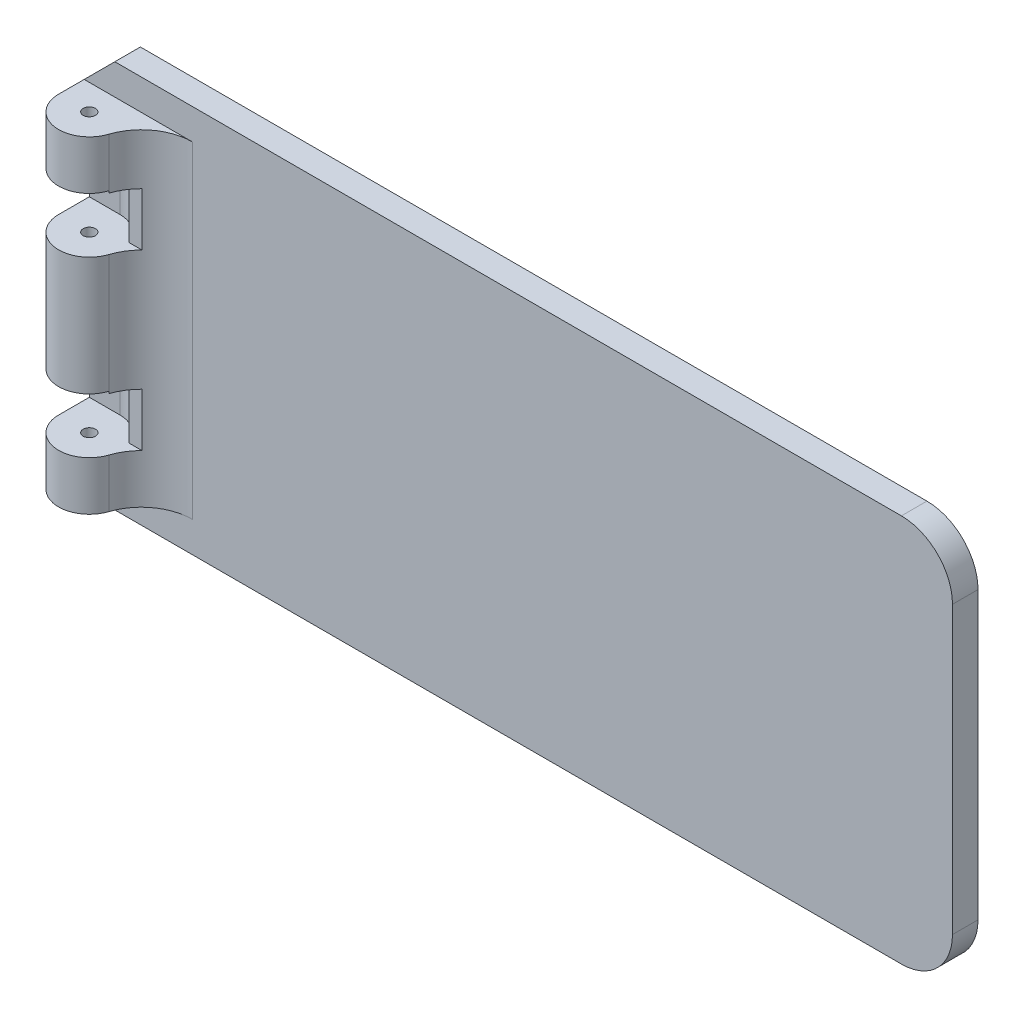
ISO-10303-21;
HEADER;
FILE_DESCRIPTION(('STEP AP214'),'2;1');
FILE_NAME('part.step','',(''),(''),'','','');
FILE_SCHEMA(('AUTOMOTIVE_DESIGN { 1 0 10303 214 1 1 1 1 }'));
ENDSEC;
DATA;
#1=APPLICATION_CONTEXT('core data for automotive mechanical design processes');
#2=APPLICATION_PROTOCOL_DEFINITION('international standard','automotive_design',2000,#1);
#3=PRODUCT_CONTEXT('',#1,'mechanical');
#4=PRODUCT('Part','Part','',(#3));
#5=PRODUCT_RELATED_PRODUCT_CATEGORY('part','',(#4));
#6=PRODUCT_DEFINITION_FORMATION('','',#4);
#7=PRODUCT_DEFINITION_CONTEXT('part definition',#1,'design');
#8=PRODUCT_DEFINITION('design','',#6,#7);
#9=PRODUCT_DEFINITION_SHAPE('','',#8);
#10=(LENGTH_UNIT() NAMED_UNIT(*) SI_UNIT(.MILLI.,.METRE.));
#11=(NAMED_UNIT(*) PLANE_ANGLE_UNIT() SI_UNIT($,.RADIAN.));
#12=(NAMED_UNIT(*) SI_UNIT($,.STERADIAN.) SOLID_ANGLE_UNIT());
#13=UNCERTAINTY_MEASURE_WITH_UNIT(LENGTH_MEASURE(1.E-05),#10,'distance_accuracy_value','');
#14=(GEOMETRIC_REPRESENTATION_CONTEXT(3) GLOBAL_UNCERTAINTY_ASSIGNED_CONTEXT((#13)) GLOBAL_UNIT_ASSIGNED_CONTEXT((#10,
#11,#12)) REPRESENTATION_CONTEXT('',''));
#15=CARTESIAN_POINT('',(0.,0.,0.));
#16=DIRECTION('',(0.,0.,1.));
#17=DIRECTION('',(1.,0.,0.));
#18=AXIS2_PLACEMENT_3D('',#15,#16,#17);
#19=CARTESIAN_POINT('',(3.,38.,5.));
#20=DIRECTION('',(0.,-1.,0.));
#21=DIRECTION('',(0.,0.,-1.));
#22=AXIS2_PLACEMENT_3D('',#19,#20,#21);
#23=CYLINDRICAL_SURFACE('',#22,3.);
#24=CARTESIAN_POINT('',(3.,3.,5.));
#25=DIRECTION('',(0.,-1.,0.));
#26=DIRECTION('',(0.,0.,-1.));
#27=AXIS2_PLACEMENT_3D('',#24,#25,#26);
#28=CIRCLE('',#27,3.);
#29=CARTESIAN_POINT('',(5.8497532787945,3.,5.9375));
#30=VERTEX_POINT('',#29);
#31=CARTESIAN_POINT('',(0.,3.,5.));
#32=VERTEX_POINT('',#31);
#33=EDGE_CURVE('E351',#30,#32,#28,.T.);
#34=ORIENTED_EDGE('',*,*,#33,.F.);
#35=DIRECTION('',(0.,-1.,0.));
#36=VECTOR('',#35,1.);
#37=CARTESIAN_POINT('',(5.8497532787945,38.,5.9375));
#38=LINE('',#37,#36);
#39=CARTESIAN_POINT('',(5.8497532787945,7.80000000000001,5.93750000000001));
#40=VERTEX_POINT('',#39);
#41=EDGE_CURVE('E281',#30,#40,#38,.F.);
#42=ORIENTED_EDGE('',*,*,#41,.T.);
#43=CARTESIAN_POINT('',(3.,7.80000000000001,5.));
#44=DIRECTION('',(0.,1.,0.));
#45=DIRECTION('',(-1.,0.,0.));
#46=AXIS2_PLACEMENT_3D('',#43,#44,#45);
#47=CIRCLE('',#46,3.);
#48=CARTESIAN_POINT('',(0.,7.80000000000001,5.));
#49=VERTEX_POINT('',#48);
#50=EDGE_CURVE('E371',#49,#40,#47,.T.);
#51=ORIENTED_EDGE('',*,*,#50,.F.);
#52=DIRECTION('',(0.,-1.,0.));
#53=VECTOR('',#52,1.);
#54=CARTESIAN_POINT('',(0.,38.,5.));
#55=LINE('',#54,#53);
#56=EDGE_CURVE('E275',#49,#32,#55,.T.);
#57=ORIENTED_EDGE('',*,*,#56,.T.);
#58=EDGE_LOOP('',(#34,#42,#51,#57));
#59=FACE_BOUND('',#58,.T.);
#60=ADVANCED_FACE('F35',(#59),#23,.T.);
#61=CARTESIAN_POINT('',(3.,38.,5.));
#62=DIRECTION('',(0.,-1.,0.));
#63=DIRECTION('',(0.,0.,-1.));
#64=AXIS2_PLACEMENT_3D('',#61,#62,#63);
#65=CYLINDRICAL_SURFACE('',#64,0.6);
#66=CARTESIAN_POINT('',(3.,7.80000000000001,5.));
#67=DIRECTION('',(0.,1.,0.));
#68=DIRECTION('',(-1.,0.,0.));
#69=AXIS2_PLACEMENT_3D('',#66,#67,#68);
#70=CIRCLE('',#69,0.6);
#71=CARTESIAN_POINT('',(2.4,7.80000000000001,5.));
#72=VERTEX_POINT('',#71);
#73=EDGE_CURVE('E389',#72,#72,#70,.T.);
#74=ORIENTED_EDGE('',*,*,#73,.T.);
#75=EDGE_LOOP('',(#74));
#76=FACE_BOUND('',#75,.T.);
#77=CARTESIAN_POINT('',(3.,3.,5.));
#78=DIRECTION('',(0.,-1.,0.));
#79=DIRECTION('',(0.,0.,-1.));
#80=AXIS2_PLACEMENT_3D('',#77,#78,#79);
#81=CIRCLE('',#80,0.6);
#82=CARTESIAN_POINT('',(3.,3.,4.4));
#83=VERTEX_POINT('',#82);
#84=EDGE_CURVE('E356',#83,#83,#81,.T.);
#85=ORIENTED_EDGE('',*,*,#84,.T.);
#86=EDGE_LOOP('',(#85));
#87=FACE_BOUND('',#86,.T.);
#88=ADVANCED_FACE('F405',(#76,#87),#65,.F.);
#89=CARTESIAN_POINT('',(10.5993420767853,38.,7.5));
#90=DIRECTION('',(0.,-1.,0.));
#91=DIRECTION('',(0.,0.,-1.));
#92=AXIS2_PLACEMENT_3D('',#89,#90,#91);
#93=CYLINDRICAL_SURFACE('',#92,5.);
#94=CARTESIAN_POINT('',(5.8497532787945,30.,5.93750000000001));
#95=VERTEX_POINT('',#94);
#96=CARTESIAN_POINT('',(5.8497532787945,30.2,5.9375));
#97=VERTEX_POINT('',#96);
#98=EDGE_CURVE('E218',#95,#97,#38,.F.);
#99=ORIENTED_EDGE('',*,*,#98,.F.);
#100=CARTESIAN_POINT('',(10.5993420767853,30.,7.5));
#101=DIRECTION('',(0.,1.,0.));
#102=DIRECTION('',(0.,0.,1.));
#103=AXIS2_PLACEMENT_3D('',#100,#101,#102);
#104=CIRCLE('',#103,5.);
#105=CARTESIAN_POINT('',(7.09098152661378,30.,3.93750000000001));
#106=VERTEX_POINT('',#105);
#107=EDGE_CURVE('E207',#95,#106,#104,.F.);
#108=ORIENTED_EDGE('',*,*,#107,.T.);
#109=DIRECTION('',(0.,-1.,0.));
#110=VECTOR('',#109,1.);
#111=CARTESIAN_POINT('',(7.09098152661378,38.,3.93750000000001));
#112=LINE('',#111,#110);
#113=CARTESIAN_POINT('',(7.09098152661378,24.8,3.93750000000001));
#114=VERTEX_POINT('',#113);
#115=EDGE_CURVE('E202',#106,#114,#112,.T.);
#116=ORIENTED_EDGE('',*,*,#115,.T.);
#117=CARTESIAN_POINT('',(10.5993420767853,24.8,7.5));
#118=DIRECTION('',(0.,-1.,0.));
#119=DIRECTION('',(0.,0.,-1.));
#120=AXIS2_PLACEMENT_3D('',#117,#118,#119);
#121=CIRCLE('',#120,5.);
#122=CARTESIAN_POINT('',(5.8497532787945,24.8,5.93750000000001));
#123=VERTEX_POINT('',#122);
#124=EDGE_CURVE('E195',#114,#123,#121,.F.);
#125=ORIENTED_EDGE('',*,*,#124,.T.);
#126=CARTESIAN_POINT('',(5.84975327879451,13.2,5.9375));
#127=VERTEX_POINT('',#126);
#128=EDGE_CURVE('E200',#127,#123,#38,.F.);
#129=ORIENTED_EDGE('',*,*,#128,.F.);
#130=CARTESIAN_POINT('',(5.8497532787945,13.,5.93750000000001));
#131=VERTEX_POINT('',#130);
#132=EDGE_CURVE('E217',#131,#127,#38,.F.);
#133=ORIENTED_EDGE('',*,*,#132,.F.);
#134=CARTESIAN_POINT('',(10.5993420767853,13.,7.5));
#135=DIRECTION('',(0.,1.,0.));
#136=DIRECTION('',(0.,0.,1.));
#137=AXIS2_PLACEMENT_3D('',#134,#135,#136);
#138=CIRCLE('',#137,5.);
#139=CARTESIAN_POINT('',(7.09098152661378,13.,3.93750000000001));
#140=VERTEX_POINT('',#139);
#141=EDGE_CURVE('E329',#131,#140,#138,.F.);
#142=ORIENTED_EDGE('',*,*,#141,.T.);
#143=DIRECTION('',(0.,-1.,0.));
#144=VECTOR('',#143,1.);
#145=CARTESIAN_POINT('',(7.09098152661378,38.,3.93750000000001));
#146=LINE('',#145,#144);
#147=CARTESIAN_POINT('',(7.09098152661378,7.80000000000001,3.93750000000001));
#148=VERTEX_POINT('',#147);
#149=EDGE_CURVE('E338',#140,#148,#146,.T.);
#150=ORIENTED_EDGE('',*,*,#149,.T.);
#151=CARTESIAN_POINT('',(10.5993420767853,7.80000000000001,7.5));
#152=DIRECTION('',(0.,-1.,0.));
#153=DIRECTION('',(0.,0.,-1.));
#154=AXIS2_PLACEMENT_3D('',#151,#152,#153);
#155=CIRCLE('',#154,5.);
#156=EDGE_CURVE('E341',#148,#40,#155,.F.);
#157=ORIENTED_EDGE('',*,*,#156,.T.);
#158=ORIENTED_EDGE('',*,*,#41,.F.);
#159=CARTESIAN_POINT('',(10.5993420767853,3.,7.5));
#160=DIRECTION('',(0.,-1.,0.));
#161=DIRECTION('',(0.,0.,-1.));
#162=AXIS2_PLACEMENT_3D('',#159,#160,#161);
#163=CIRCLE('',#162,5.);
#164=CARTESIAN_POINT('',(10.5993420767853,3.,2.5));
#165=VERTEX_POINT('',#164);
#166=EDGE_CURVE('E287',#165,#30,#163,.F.);
#167=ORIENTED_EDGE('',*,*,#166,.F.);
#168=DIRECTION('',(0.,1.,0.));
#169=VECTOR('',#168,1.);
#170=CARTESIAN_POINT('',(10.5993420767853,0.,2.5));
#171=LINE('',#170,#169);
#172=CARTESIAN_POINT('',(10.5993420767853,35.,2.5));
#173=VERTEX_POINT('',#172);
#174=EDGE_CURVE('E278',#173,#165,#171,.F.);
#175=ORIENTED_EDGE('',*,*,#174,.F.);
#176=CARTESIAN_POINT('',(10.5993420767853,35.,7.5));
#177=DIRECTION('',(0.,-1.,0.));
#178=DIRECTION('',(0.,0.,-1.));
#179=AXIS2_PLACEMENT_3D('',#176,#177,#178);
#180=CIRCLE('',#179,5.);
#181=CARTESIAN_POINT('',(5.8497532787945,35.,5.9375));
#182=VERTEX_POINT('',#181);
#183=EDGE_CURVE('E284',#173,#182,#180,.F.);
#184=ORIENTED_EDGE('',*,*,#183,.T.);
#185=EDGE_CURVE('E220',#97,#182,#38,.F.);
#186=ORIENTED_EDGE('',*,*,#185,.F.);
#187=EDGE_LOOP('',(#99,#108,#116,#125,#129,#133,#142,#150,#157,#158,#167,#175,#184,#186));
#188=FACE_BOUND('',#187,.T.);
#189=ADVANCED_FACE('F198',(#188),#93,.F.);
#190=CARTESIAN_POINT('',(0.,24.8,5.));
#191=VERTEX_POINT('',#190);
#192=CARTESIAN_POINT('',(0.,13.2,5.));
#193=VERTEX_POINT('',#192);
#194=EDGE_CURVE('E279',#191,#193,#55,.T.);
#195=ORIENTED_EDGE('',*,*,#194,.T.);
#196=CARTESIAN_POINT('',(3.,13.2,5.));
#197=DIRECTION('',(0.,1.,0.));
#198=DIRECTION('',(-1.,0.,0.));
#199=AXIS2_PLACEMENT_3D('',#196,#197,#198);
#200=CIRCLE('',#199,3.);
#201=EDGE_CURVE('E216',#193,#127,#200,.T.);
#202=ORIENTED_EDGE('',*,*,#201,.T.);
#203=ORIENTED_EDGE('',*,*,#128,.T.);
#204=CARTESIAN_POINT('',(3.,24.8,5.));
#205=DIRECTION('',(0.,1.,0.));
#206=DIRECTION('',(0.,0.,1.));
#207=AXIS2_PLACEMENT_3D('',#204,#205,#206);
#208=CIRCLE('',#207,3.);
#209=EDGE_CURVE('E214',#191,#123,#208,.T.);
#210=ORIENTED_EDGE('',*,*,#209,.F.);
#211=EDGE_LOOP('',(#195,#202,#203,#210));
#212=FACE_BOUND('',#211,.T.);
#213=ADVANCED_FACE('F213',(#212),#23,.T.);
#214=CARTESIAN_POINT('',(3.,13.2,5.));
#215=DIRECTION('',(0.,1.,0.));
#216=DIRECTION('',(-1.,0.,0.));
#217=AXIS2_PLACEMENT_3D('',#214,#215,#216);
#218=CIRCLE('',#217,0.6);
#219=CARTESIAN_POINT('',(2.4,13.2,5.));
#220=VERTEX_POINT('',#219);
#221=EDGE_CURVE('E229',#220,#220,#218,.T.);
#222=ORIENTED_EDGE('',*,*,#221,.F.);
#223=EDGE_LOOP('',(#222));
#224=FACE_BOUND('',#223,.T.);
#225=CARTESIAN_POINT('',(3.,24.8,5.));
#226=DIRECTION('',(0.,1.,0.));
#227=DIRECTION('',(0.,0.,1.));
#228=AXIS2_PLACEMENT_3D('',#225,#226,#227);
#229=CIRCLE('',#228,0.6);
#230=CARTESIAN_POINT('',(3.,24.8,5.6));
#231=VERTEX_POINT('',#230);
#232=EDGE_CURVE('E248',#231,#231,#229,.T.);
#233=ORIENTED_EDGE('',*,*,#232,.T.);
#234=EDGE_LOOP('',(#233));
#235=FACE_BOUND('',#234,.T.);
#236=ADVANCED_FACE('F399',(#224,#235),#65,.F.);
#237=CARTESIAN_POINT('',(0.,38.,0.));
#238=DIRECTION('',(1.,0.,0.));
#239=DIRECTION('',(0.,0.,-1.));
#240=AXIS2_PLACEMENT_3D('',#237,#238,#239);
#241=PLANE('',#240);
#242=DIRECTION('',(0.,0.,-1.));
#243=VECTOR('',#242,1.);
#244=CARTESIAN_POINT('',(0.,35.,0.));
#245=LINE('',#244,#243);
#246=CARTESIAN_POINT('',(0.,35.,5.));
#247=VERTEX_POINT('',#246);
#248=CARTESIAN_POINT('',(0.,35.,2.5));
#249=VERTEX_POINT('',#248);
#250=EDGE_CURVE('E365',#247,#249,#245,.T.);
#251=ORIENTED_EDGE('',*,*,#250,.T.);
#252=DIRECTION('',(0.,0.,-1.));
#253=VECTOR('',#252,1.);
#254=CARTESIAN_POINT('',(0.,35.,0.));
#255=LINE('',#254,#253);
#256=CARTESIAN_POINT('',(0.,35.,0.));
#257=VERTEX_POINT('',#256);
#258=EDGE_CURVE('E299',#249,#257,#255,.T.);
#259=ORIENTED_EDGE('',*,*,#258,.T.);
#260=DIRECTION('',(0.,-1.,0.));
#261=VECTOR('',#260,1.);
#262=CARTESIAN_POINT('',(0.,38.,0.));
#263=LINE('',#262,#261);
#264=CARTESIAN_POINT('',(0.,3.,0.));
#265=VERTEX_POINT('',#264);
#266=EDGE_CURVE('E262',#257,#265,#263,.T.);
#267=ORIENTED_EDGE('',*,*,#266,.T.);
#268=DIRECTION('',(0.,0.,1.));
#269=VECTOR('',#268,1.);
#270=CARTESIAN_POINT('',(0.,3.,0.));
#271=LINE('',#270,#269);
#272=CARTESIAN_POINT('',(0.,3.,2.5));
#273=VERTEX_POINT('',#272);
#274=EDGE_CURVE('E296',#265,#273,#271,.T.);
#275=ORIENTED_EDGE('',*,*,#274,.T.);
#276=DIRECTION('',(0.,0.,-1.));
#277=VECTOR('',#276,1.);
#278=CARTESIAN_POINT('',(0.,3.,0.));
#279=LINE('',#278,#277);
#280=EDGE_CURVE('E353',#32,#273,#279,.T.);
#281=ORIENTED_EDGE('',*,*,#280,.F.);
#282=ORIENTED_EDGE('',*,*,#56,.F.);
#283=DIRECTION('',(0.,0.,1.));
#284=VECTOR('',#283,1.);
#285=CARTESIAN_POINT('',(0.,7.80000000000001,0.));
#286=LINE('',#285,#284);
#287=CARTESIAN_POINT('',(0.,7.80000000000001,2.));
#288=VERTEX_POINT('',#287);
#289=EDGE_CURVE('E377',#288,#49,#286,.T.);
#290=ORIENTED_EDGE('',*,*,#289,.F.);
#291=DIRECTION('',(0.,-1.,0.));
#292=VECTOR('',#291,1.);
#293=CARTESIAN_POINT('',(0.,13.2,2.));
#294=LINE('',#293,#292);
#295=CARTESIAN_POINT('',(0.,13.2,2.));
#296=VERTEX_POINT('',#295);
#297=EDGE_CURVE('E386',#296,#288,#294,.T.);
#298=ORIENTED_EDGE('',*,*,#297,.F.);
#299=DIRECTION('',(0.,0.,1.));
#300=VECTOR('',#299,1.);
#301=CARTESIAN_POINT('',(0.,13.2,0.));
#302=LINE('',#301,#300);
#303=EDGE_CURVE('E383',#296,#193,#302,.T.);
#304=ORIENTED_EDGE('',*,*,#303,.T.);
#305=ORIENTED_EDGE('',*,*,#194,.F.);
#306=DIRECTION('',(0.,0.,1.));
#307=VECTOR('',#306,1.);
#308=CARTESIAN_POINT('',(0.,24.8,0.));
#309=LINE('',#308,#307);
#310=CARTESIAN_POINT('',(0.,24.8,2.));
#311=VERTEX_POINT('',#310);
#312=EDGE_CURVE('E224',#311,#191,#309,.T.);
#313=ORIENTED_EDGE('',*,*,#312,.F.);
#314=DIRECTION('',(0.,-1.,0.));
#315=VECTOR('',#314,1.);
#316=CARTESIAN_POINT('',(0.,30.2,2.));
#317=LINE('',#316,#315);
#318=CARTESIAN_POINT('',(0.,30.2,2.));
#319=VERTEX_POINT('',#318);
#320=EDGE_CURVE('E243',#319,#311,#317,.T.);
#321=ORIENTED_EDGE('',*,*,#320,.F.);
#322=DIRECTION('',(0.,0.,1.));
#323=VECTOR('',#322,1.);
#324=CARTESIAN_POINT('',(0.,30.2,0.));
#325=LINE('',#324,#323);
#326=CARTESIAN_POINT('',(0.,30.2,5.));
#327=VERTEX_POINT('',#326);
#328=EDGE_CURVE('E240',#319,#327,#325,.T.);
#329=ORIENTED_EDGE('',*,*,#328,.T.);
#330=EDGE_CURVE('E276',#247,#327,#55,.T.);
#331=ORIENTED_EDGE('',*,*,#330,.F.);
#332=EDGE_LOOP('',(#251,#259,#267,#275,#281,#282,#290,#298,#304,#305,#313,#321,#329,#331));
#333=FACE_BOUND('',#332,.T.);
#334=ADVANCED_FACE('F402',(#333),#241,.F.);
#335=ORIENTED_EDGE('',*,*,#185,.T.);
#336=CARTESIAN_POINT('',(3.,35.,5.));
#337=DIRECTION('',(0.,-1.,0.));
#338=DIRECTION('',(0.,0.,-1.));
#339=AXIS2_PLACEMENT_3D('',#336,#337,#338);
#340=CIRCLE('',#339,3.);
#341=EDGE_CURVE('E362',#182,#247,#340,.T.);
#342=ORIENTED_EDGE('',*,*,#341,.T.);
#343=ORIENTED_EDGE('',*,*,#330,.T.);
#344=CARTESIAN_POINT('',(3.,30.2,5.));
#345=DIRECTION('',(0.,1.,0.));
#346=DIRECTION('',(0.,0.,1.));
#347=AXIS2_PLACEMENT_3D('',#344,#345,#346);
#348=CIRCLE('',#347,3.);
#349=EDGE_CURVE('E235',#327,#97,#348,.T.);
#350=ORIENTED_EDGE('',*,*,#349,.T.);
#351=EDGE_LOOP('',(#335,#342,#343,#350));
#352=FACE_BOUND('',#351,.T.);
#353=ADVANCED_FACE('F423',(#352),#23,.T.);
#354=CARTESIAN_POINT('',(0.,38.,2.5));
#355=DIRECTION('',(0.,0.,-1.));
#356=DIRECTION('',(-1.,0.,0.));
#357=AXIS2_PLACEMENT_3D('',#354,#355,#356);
#358=PLANE('',#357);
#359=DIRECTION('',(1.,0.,0.));
#360=VECTOR('',#359,1.);
#361=CARTESIAN_POINT('',(0.,0.,2.5));
#362=LINE('',#361,#360);
#363=CARTESIAN_POINT('',(3.00000000000003,0.,2.5));
#364=VERTEX_POINT('',#363);
#365=CARTESIAN_POINT('',(80.,0.,2.5));
#366=VERTEX_POINT('',#365);
#367=EDGE_CURVE('E254',#364,#366,#362,.T.);
#368=ORIENTED_EDGE('',*,*,#367,.T.);
#369=CARTESIAN_POINT('',(80.,5.,2.5));
#370=DIRECTION('',(0.,0.,-1.));
#371=DIRECTION('',(-1.,0.,0.));
#372=AXIS2_PLACEMENT_3D('',#369,#370,#371);
#373=CIRCLE('',#372,5.);
#374=CARTESIAN_POINT('',(85.,5.,2.5));
#375=VERTEX_POINT('',#374);
#376=EDGE_CURVE('E312',#366,#375,#373,.F.);
#377=ORIENTED_EDGE('',*,*,#376,.T.);
#378=DIRECTION('',(0.,-1.,0.));
#379=VECTOR('',#378,1.);
#380=CARTESIAN_POINT('',(85.,38.,2.5));
#381=LINE('',#380,#379);
#382=CARTESIAN_POINT('',(85.,33.,2.5));
#383=VERTEX_POINT('',#382);
#384=EDGE_CURVE('E272',#383,#375,#381,.T.);
#385=ORIENTED_EDGE('',*,*,#384,.F.);
#386=CARTESIAN_POINT('',(80.,33.,2.5));
#387=DIRECTION('',(0.,0.,-1.));
#388=DIRECTION('',(-1.,0.,0.));
#389=AXIS2_PLACEMENT_3D('',#386,#387,#388);
#390=CIRCLE('',#389,5.);
#391=CARTESIAN_POINT('',(80.,38.,2.5));
#392=VERTEX_POINT('',#391);
#393=EDGE_CURVE('E310',#383,#392,#390,.F.);
#394=ORIENTED_EDGE('',*,*,#393,.T.);
#395=DIRECTION('',(1.,0.,0.));
#396=VECTOR('',#395,1.);
#397=CARTESIAN_POINT('',(0.,38.,2.5));
#398=LINE('',#397,#396);
#399=CARTESIAN_POINT('',(3.,38.,2.5));
#400=VERTEX_POINT('',#399);
#401=EDGE_CURVE('E255',#400,#392,#398,.T.);
#402=ORIENTED_EDGE('',*,*,#401,.F.);
#403=DIRECTION('',(-0.707106781186544,-0.707106781186551,0.));
#404=VECTOR('',#403,1.);
#405=CARTESIAN_POINT('',(3.,38.,2.5));
#406=LINE('',#405,#404);
#407=EDGE_CURVE('E294',#400,#249,#406,.T.);
#408=ORIENTED_EDGE('',*,*,#407,.T.);
#409=DIRECTION('',(-1.,0.,0.));
#410=VECTOR('',#409,1.);
#411=CARTESIAN_POINT('',(13.726266396713,35.,2.5));
#412=LINE('',#411,#410);
#413=EDGE_CURVE('E359',#173,#249,#412,.T.);
#414=ORIENTED_EDGE('',*,*,#413,.F.);
#415=ORIENTED_EDGE('',*,*,#174,.T.);
#416=DIRECTION('',(1.,0.,0.));
#417=VECTOR('',#416,1.);
#418=CARTESIAN_POINT('',(25.4714521459505,3.,2.5));
#419=LINE('',#418,#417);
#420=EDGE_CURVE('E349',#273,#165,#419,.T.);
#421=ORIENTED_EDGE('',*,*,#420,.F.);
#422=DIRECTION('',(-0.707106781186551,0.707106781186544,0.));
#423=VECTOR('',#422,1.);
#424=CARTESIAN_POINT('',(0.,3.,2.5));
#425=LINE('',#424,#423);
#426=EDGE_CURVE('E292',#273,#364,#425,.F.);
#427=ORIENTED_EDGE('',*,*,#426,.T.);
#428=EDGE_LOOP('',(#368,#377,#385,#394,#402,#408,#414,#415,#421,#427));
#429=FACE_BOUND('',#428,.T.);
#430=ADVANCED_FACE('F432',(#429),#358,.F.);
#431=CARTESIAN_POINT('',(85.,38.,0.));
#432=DIRECTION('',(1.,0.,0.));
#433=DIRECTION('',(0.,0.,-1.));
#434=AXIS2_PLACEMENT_3D('',#431,#432,#433);
#435=PLANE('',#434);
#436=ORIENTED_EDGE('',*,*,#384,.T.);
#437=DIRECTION('',(0.,0.,1.));
#438=VECTOR('',#437,1.);
#439=CARTESIAN_POINT('',(85.,5.,0.));
#440=LINE('',#439,#438);
#441=CARTESIAN_POINT('',(85.,5.,0.));
#442=VERTEX_POINT('',#441);
#443=EDGE_CURVE('E317',#375,#442,#440,.F.);
#444=ORIENTED_EDGE('',*,*,#443,.T.);
#445=DIRECTION('',(0.,-1.,0.));
#446=VECTOR('',#445,1.);
#447=CARTESIAN_POINT('',(85.,38.,0.));
#448=LINE('',#447,#446);
#449=CARTESIAN_POINT('',(85.,33.,0.));
#450=VERTEX_POINT('',#449);
#451=EDGE_CURVE('E269',#450,#442,#448,.T.);
#452=ORIENTED_EDGE('',*,*,#451,.F.);
#453=DIRECTION('',(0.,0.,1.));
#454=VECTOR('',#453,1.);
#455=CARTESIAN_POINT('',(85.,33.,0.));
#456=LINE('',#455,#454);
#457=EDGE_CURVE('E314',#450,#383,#456,.T.);
#458=ORIENTED_EDGE('',*,*,#457,.T.);
#459=EDGE_LOOP('',(#436,#444,#452,#458));
#460=FACE_BOUND('',#459,.T.);
#461=ADVANCED_FACE('F438',(#460),#435,.T.);
#462=CARTESIAN_POINT('',(0.,38.,0.));
#463=DIRECTION('',(0.,0.,-1.));
#464=DIRECTION('',(-1.,0.,0.));
#465=AXIS2_PLACEMENT_3D('',#462,#463,#464);
#466=PLANE('',#465);
#467=ORIENTED_EDGE('',*,*,#451,.T.);
#468=CARTESIAN_POINT('',(80.,5.,0.));
#469=DIRECTION('',(0.,0.,-1.));
#470=DIRECTION('',(-1.,0.,0.));
#471=AXIS2_PLACEMENT_3D('',#468,#469,#470);
#472=CIRCLE('',#471,5.);
#473=CARTESIAN_POINT('',(80.,0.,0.));
#474=VERTEX_POINT('',#473);
#475=EDGE_CURVE('E321',#442,#474,#472,.T.);
#476=ORIENTED_EDGE('',*,*,#475,.T.);
#477=DIRECTION('',(1.,0.,0.));
#478=VECTOR('',#477,1.);
#479=CARTESIAN_POINT('',(0.,0.,0.));
#480=LINE('',#479,#478);
#481=CARTESIAN_POINT('',(3.00000000000003,0.,0.));
#482=VERTEX_POINT('',#481);
#483=EDGE_CURVE('E259',#482,#474,#480,.T.);
#484=ORIENTED_EDGE('',*,*,#483,.F.);
#485=DIRECTION('',(0.707106781186551,-0.707106781186544,0.));
#486=VECTOR('',#485,1.);
#487=CARTESIAN_POINT('',(-17.5,20.4999999999998,0.));
#488=LINE('',#487,#486);
#489=EDGE_CURVE('E301',#482,#265,#488,.F.);
#490=ORIENTED_EDGE('',*,*,#489,.T.);
#491=ORIENTED_EDGE('',*,*,#266,.F.);
#492=DIRECTION('',(0.707106781186544,0.707106781186551,0.));
#493=VECTOR('',#492,1.);
#494=CARTESIAN_POINT('',(1.50000000000002,36.5,0.));
#495=LINE('',#494,#493);
#496=CARTESIAN_POINT('',(3.,38.,0.));
#497=VERTEX_POINT('',#496);
#498=EDGE_CURVE('E303',#257,#497,#495,.T.);
#499=ORIENTED_EDGE('',*,*,#498,.T.);
#500=DIRECTION('',(1.,0.,0.));
#501=VECTOR('',#500,1.);
#502=CARTESIAN_POINT('',(0.,38.,0.));
#503=LINE('',#502,#501);
#504=CARTESIAN_POINT('',(80.,38.,0.));
#505=VERTEX_POINT('',#504);
#506=EDGE_CURVE('E258',#497,#505,#503,.T.);
#507=ORIENTED_EDGE('',*,*,#506,.T.);
#508=CARTESIAN_POINT('',(80.,33.,0.));
#509=DIRECTION('',(0.,0.,-1.));
#510=DIRECTION('',(-1.,0.,0.));
#511=AXIS2_PLACEMENT_3D('',#508,#509,#510);
#512=CIRCLE('',#511,5.);
#513=EDGE_CURVE('E319',#505,#450,#512,.T.);
#514=ORIENTED_EDGE('',*,*,#513,.T.);
#515=EDGE_LOOP('',(#467,#476,#484,#490,#491,#499,#507,#514));
#516=FACE_BOUND('',#515,.T.);
#517=ADVANCED_FACE('F489',(#516),#466,.T.);
#518=CARTESIAN_POINT('',(3.,35.,5.));
#519=DIRECTION('',(0.,-1.,0.));
#520=DIRECTION('',(0.,0.,-1.));
#521=AXIS2_PLACEMENT_3D('',#518,#519,#520);
#522=CIRCLE('',#521,0.6);
#523=CARTESIAN_POINT('',(3.,35.,4.4));
#524=VERTEX_POINT('',#523);
#525=EDGE_CURVE('E368',#524,#524,#522,.T.);
#526=ORIENTED_EDGE('',*,*,#525,.F.);
#527=EDGE_LOOP('',(#526));
#528=FACE_BOUND('',#527,.T.);
#529=CARTESIAN_POINT('',(3.,30.2,5.));
#530=DIRECTION('',(0.,1.,0.));
#531=DIRECTION('',(0.,0.,1.));
#532=AXIS2_PLACEMENT_3D('',#529,#530,#531);
#533=CIRCLE('',#532,0.6);
#534=CARTESIAN_POINT('',(3.,30.2,5.6));
#535=VERTEX_POINT('',#534);
#536=EDGE_CURVE('E251',#535,#535,#533,.T.);
#537=ORIENTED_EDGE('',*,*,#536,.F.);
#538=EDGE_LOOP('',(#537));
#539=FACE_BOUND('',#538,.T.);
#540=ADVANCED_FACE('F404',(#528,#539),#65,.F.);
#541=CARTESIAN_POINT('',(0.,38.,0.));
#542=DIRECTION('',(0.,1.,0.));
#543=DIRECTION('',(0.,0.,1.));
#544=AXIS2_PLACEMENT_3D('',#541,#542,#543);
#545=PLANE('',#544);
#546=ORIENTED_EDGE('',*,*,#401,.T.);
#547=DIRECTION('',(0.,0.,1.));
#548=VECTOR('',#547,1.);
#549=CARTESIAN_POINT('',(80.,38.,0.));
#550=LINE('',#549,#548);
#551=EDGE_CURVE('E323',#392,#505,#550,.F.);
#552=ORIENTED_EDGE('',*,*,#551,.T.);
#553=ORIENTED_EDGE('',*,*,#506,.F.);
#554=DIRECTION('',(0.,0.,1.));
#555=VECTOR('',#554,1.);
#556=CARTESIAN_POINT('',(3.,38.,2.5));
#557=LINE('',#556,#555);
#558=EDGE_CURVE('E289',#497,#400,#557,.T.);
#559=ORIENTED_EDGE('',*,*,#558,.T.);
#560=EDGE_LOOP('',(#546,#552,#553,#559));
#561=FACE_BOUND('',#560,.T.);
#562=ADVANCED_FACE('F481',(#561),#545,.T.);
#563=CARTESIAN_POINT('',(0.,0.,0.));
#564=DIRECTION('',(0.,1.,0.));
#565=DIRECTION('',(0.,0.,1.));
#566=AXIS2_PLACEMENT_3D('',#563,#564,#565);
#567=PLANE('',#566);
#568=ORIENTED_EDGE('',*,*,#483,.T.);
#569=DIRECTION('',(0.,0.,1.));
#570=VECTOR('',#569,1.);
#571=CARTESIAN_POINT('',(80.,0.,2.5));
#572=LINE('',#571,#570);
#573=EDGE_CURVE('E307',#474,#366,#572,.T.);
#574=ORIENTED_EDGE('',*,*,#573,.T.);
#575=ORIENTED_EDGE('',*,*,#367,.F.);
#576=DIRECTION('',(0.,0.,-1.));
#577=VECTOR('',#576,1.);
#578=CARTESIAN_POINT('',(3.00000000000003,0.,0.));
#579=LINE('',#578,#577);
#580=EDGE_CURVE('E305',#364,#482,#579,.T.);
#581=ORIENTED_EDGE('',*,*,#580,.T.);
#582=EDGE_LOOP('',(#568,#574,#575,#581));
#583=FACE_BOUND('',#582,.T.);
#584=ADVANCED_FACE('F474',(#583),#567,.F.);
#585=CARTESIAN_POINT('',(3.,30.2,5.));
#586=DIRECTION('',(0.,-1.,0.));
#587=DIRECTION('',(1.,0.,0.));
#588=AXIS2_PLACEMENT_3D('',#585,#586,#587);
#589=CYLINDRICAL_SURFACE('',#588,3.);
#590=CARTESIAN_POINT('',(3.,30.,5.));
#591=DIRECTION('',(0.,1.,0.));
#592=DIRECTION('',(0.,0.,1.));
#593=AXIS2_PLACEMENT_3D('',#590,#591,#592);
#594=CIRCLE('',#593,3.);
#595=CARTESIAN_POINT('',(5.80554696093293,30.,3.93750000000001));
#596=VERTEX_POINT('',#595);
#597=EDGE_CURVE('E11',#95,#596,#594,.T.);
#598=ORIENTED_EDGE('',*,*,#597,.F.);
#599=ORIENTED_EDGE('',*,*,#98,.T.);
#600=CARTESIAN_POINT('',(3.,30.2,2.));
#601=VERTEX_POINT('',#600);
#602=EDGE_CURVE('E234',#97,#601,#348,.T.);
#603=ORIENTED_EDGE('',*,*,#602,.T.);
#604=DIRECTION('',(0.,-1.,0.));
#605=VECTOR('',#604,1.);
#606=CARTESIAN_POINT('',(3.,30.2,2.));
#607=LINE('',#606,#605);
#608=CARTESIAN_POINT('',(3.,24.8,2.));
#609=VERTEX_POINT('',#608);
#610=EDGE_CURVE('E245',#601,#609,#607,.T.);
#611=ORIENTED_EDGE('',*,*,#610,.T.);
#612=CARTESIAN_POINT('',(5.80554696093293,24.8,3.93750000000001));
#613=VERTEX_POINT('',#612);
#614=EDGE_CURVE('E226',#613,#609,#208,.T.);
#615=ORIENTED_EDGE('',*,*,#614,.F.);
#616=DIRECTION('',(0.,-1.,0.));
#617=VECTOR('',#616,1.);
#618=CARTESIAN_POINT('',(5.80554696093293,30.2,3.93750000000001));
#619=LINE('',#618,#617);
#620=EDGE_CURVE('E537',#596,#613,#619,.T.);
#621=ORIENTED_EDGE('',*,*,#620,.F.);
#622=EDGE_LOOP('',(#598,#599,#603,#611,#615,#621));
#623=FACE_BOUND('',#622,.T.);
#624=ADVANCED_FACE('F471',(#623),#589,.F.);
#625=CARTESIAN_POINT('',(0.,30.2,2.));
#626=DIRECTION('',(0.,0.,1.));
#627=DIRECTION('',(1.,0.,0.));
#628=AXIS2_PLACEMENT_3D('',#625,#626,#627);
#629=PLANE('',#628);
#630=ORIENTED_EDGE('',*,*,#610,.F.);
#631=DIRECTION('',(-1.,0.,0.));
#632=VECTOR('',#631,1.);
#633=CARTESIAN_POINT('',(0.,30.2,2.));
#634=LINE('',#633,#632);
#635=EDGE_CURVE('E238',#601,#319,#634,.T.);
#636=ORIENTED_EDGE('',*,*,#635,.T.);
#637=ORIENTED_EDGE('',*,*,#320,.T.);
#638=DIRECTION('',(-1.,0.,0.));
#639=VECTOR('',#638,1.);
#640=CARTESIAN_POINT('',(0.,24.8,2.));
#641=LINE('',#640,#639);
#642=EDGE_CURVE('E225',#609,#311,#641,.T.);
#643=ORIENTED_EDGE('',*,*,#642,.F.);
#644=EDGE_LOOP('',(#630,#636,#637,#643));
#645=FACE_BOUND('',#644,.T.);
#646=ADVANCED_FACE('F417',(#645),#629,.T.);
#647=CARTESIAN_POINT('',(0.,30.2,0.));
#648=DIRECTION('',(0.,1.,0.));
#649=DIRECTION('',(0.,0.,1.));
#650=AXIS2_PLACEMENT_3D('',#647,#648,#649);
#651=PLANE('',#650);
#652=ORIENTED_EDGE('',*,*,#536,.T.);
#653=EDGE_LOOP('',(#652));
#654=FACE_BOUND('',#653,.T.);
#655=ORIENTED_EDGE('',*,*,#349,.F.);
#656=ORIENTED_EDGE('',*,*,#328,.F.);
#657=ORIENTED_EDGE('',*,*,#635,.F.);
#658=ORIENTED_EDGE('',*,*,#602,.F.);
#659=EDGE_LOOP('',(#655,#656,#657,#658));
#660=FACE_BOUND('',#659,.T.);
#661=ADVANCED_FACE('F409',(#654,#660),#651,.F.);
#662=CARTESIAN_POINT('',(0.,24.8,0.));
#663=DIRECTION('',(0.,1.,0.));
#664=DIRECTION('',(0.,0.,1.));
#665=AXIS2_PLACEMENT_3D('',#662,#663,#664);
#666=PLANE('',#665);
#667=ORIENTED_EDGE('',*,*,#232,.F.);
#668=EDGE_LOOP('',(#667));
#669=FACE_BOUND('',#668,.T.);
#670=ORIENTED_EDGE('',*,*,#209,.T.);
#671=ORIENTED_EDGE('',*,*,#124,.F.);
#672=DIRECTION('',(1.,0.,0.));
#673=VECTOR('',#672,1.);
#674=CARTESIAN_POINT('',(3.48326253102262,24.8,3.93750000000001));
#675=LINE('',#674,#673);
#676=EDGE_CURVE('E469',#613,#114,#675,.T.);
#677=ORIENTED_EDGE('',*,*,#676,.F.);
#678=ORIENTED_EDGE('',*,*,#614,.T.);
#679=ORIENTED_EDGE('',*,*,#642,.T.);
#680=ORIENTED_EDGE('',*,*,#312,.T.);
#681=EDGE_LOOP('',(#670,#671,#677,#678,#679,#680));
#682=FACE_BOUND('',#681,.T.);
#683=ADVANCED_FACE('F221',(#669,#682),#666,.T.);
#684=CARTESIAN_POINT('',(3.,13.2,5.));
#685=DIRECTION('',(0.,-1.,0.));
#686=DIRECTION('',(1.,0.,0.));
#687=AXIS2_PLACEMENT_3D('',#684,#685,#686);
#688=CYLINDRICAL_SURFACE('',#687,3.);
#689=CARTESIAN_POINT('',(3.,13.,5.));
#690=DIRECTION('',(0.,1.,0.));
#691=DIRECTION('',(0.,0.,1.));
#692=AXIS2_PLACEMENT_3D('',#689,#690,#691);
#693=CIRCLE('',#692,3.);
#694=CARTESIAN_POINT('',(5.80554696093294,13.,3.93750000000001));
#695=VERTEX_POINT('',#694);
#696=EDGE_CURVE('E43',#131,#695,#693,.T.);
#697=ORIENTED_EDGE('',*,*,#696,.F.);
#698=ORIENTED_EDGE('',*,*,#132,.T.);
#699=CARTESIAN_POINT('',(3.,13.2,2.));
#700=VERTEX_POINT('',#699);
#701=EDGE_CURVE('E379',#127,#700,#200,.T.);
#702=ORIENTED_EDGE('',*,*,#701,.T.);
#703=DIRECTION('',(0.,-1.,0.));
#704=VECTOR('',#703,1.);
#705=CARTESIAN_POINT('',(3.,13.2,2.));
#706=LINE('',#705,#704);
#707=CARTESIAN_POINT('',(3.,7.80000000000001,2.));
#708=VERTEX_POINT('',#707);
#709=EDGE_CURVE('E388',#700,#708,#706,.T.);
#710=ORIENTED_EDGE('',*,*,#709,.T.);
#711=CARTESIAN_POINT('',(5.80554696093294,7.80000000000001,3.93750000000001));
#712=VERTEX_POINT('',#711);
#713=EDGE_CURVE('E335',#712,#708,#47,.T.);
#714=ORIENTED_EDGE('',*,*,#713,.F.);
#715=DIRECTION('',(0.,-1.,0.));
#716=VECTOR('',#715,1.);
#717=CARTESIAN_POINT('',(5.80554696093294,13.2,3.93750000000001));
#718=LINE('',#717,#716);
#719=EDGE_CURVE('E332',#695,#712,#718,.T.);
#720=ORIENTED_EDGE('',*,*,#719,.F.);
#721=EDGE_LOOP('',(#697,#698,#702,#710,#714,#720));
#722=FACE_BOUND('',#721,.T.);
#723=ADVANCED_FACE('F333',(#722),#688,.F.);
#724=CARTESIAN_POINT('',(0.,13.2,2.));
#725=DIRECTION('',(0.,0.,1.));
#726=DIRECTION('',(1.,0.,0.));
#727=AXIS2_PLACEMENT_3D('',#724,#725,#726);
#728=PLANE('',#727);
#729=ORIENTED_EDGE('',*,*,#709,.F.);
#730=DIRECTION('',(-1.,0.,0.));
#731=VECTOR('',#730,1.);
#732=CARTESIAN_POINT('',(0.,13.2,2.));
#733=LINE('',#732,#731);
#734=EDGE_CURVE('E381',#700,#296,#733,.T.);
#735=ORIENTED_EDGE('',*,*,#734,.T.);
#736=ORIENTED_EDGE('',*,*,#297,.T.);
#737=DIRECTION('',(-1.,0.,0.));
#738=VECTOR('',#737,1.);
#739=CARTESIAN_POINT('',(0.,7.80000000000001,2.));
#740=LINE('',#739,#738);
#741=EDGE_CURVE('E374',#708,#288,#740,.T.);
#742=ORIENTED_EDGE('',*,*,#741,.F.);
#743=EDGE_LOOP('',(#729,#735,#736,#742));
#744=FACE_BOUND('',#743,.T.);
#745=ADVANCED_FACE('F415',(#744),#728,.T.);
#746=CARTESIAN_POINT('',(0.,13.2,0.));
#747=DIRECTION('',(0.,1.,0.));
#748=DIRECTION('',(-1.,0.,0.));
#749=AXIS2_PLACEMENT_3D('',#746,#747,#748);
#750=PLANE('',#749);
#751=ORIENTED_EDGE('',*,*,#221,.T.);
#752=EDGE_LOOP('',(#751));
#753=FACE_BOUND('',#752,.T.);
#754=ORIENTED_EDGE('',*,*,#201,.F.);
#755=ORIENTED_EDGE('',*,*,#303,.F.);
#756=ORIENTED_EDGE('',*,*,#734,.F.);
#757=ORIENTED_EDGE('',*,*,#701,.F.);
#758=EDGE_LOOP('',(#754,#755,#756,#757));
#759=FACE_BOUND('',#758,.T.);
#760=ADVANCED_FACE('F396',(#753,#759),#750,.F.);
#761=CARTESIAN_POINT('',(0.,7.80000000000001,0.));
#762=DIRECTION('',(0.,1.,0.));
#763=DIRECTION('',(-1.,0.,0.));
#764=AXIS2_PLACEMENT_3D('',#761,#762,#763);
#765=PLANE('',#764);
#766=ORIENTED_EDGE('',*,*,#73,.F.);
#767=EDGE_LOOP('',(#766));
#768=FACE_BOUND('',#767,.T.);
#769=ORIENTED_EDGE('',*,*,#50,.T.);
#770=ORIENTED_EDGE('',*,*,#156,.F.);
#771=DIRECTION('',(1.,0.,0.));
#772=VECTOR('',#771,1.);
#773=CARTESIAN_POINT('',(3.48326253102262,7.80000000000001,3.93750000000001));
#774=LINE('',#773,#772);
#775=EDGE_CURVE('E343',#712,#148,#774,.T.);
#776=ORIENTED_EDGE('',*,*,#775,.F.);
#777=ORIENTED_EDGE('',*,*,#713,.T.);
#778=ORIENTED_EDGE('',*,*,#741,.T.);
#779=ORIENTED_EDGE('',*,*,#289,.T.);
#780=EDGE_LOOP('',(#769,#770,#776,#777,#778,#779));
#781=FACE_BOUND('',#780,.T.);
#782=ADVANCED_FACE('F457',(#768,#781),#765,.T.);
#783=CARTESIAN_POINT('',(0.,35.,0.));
#784=DIRECTION('',(0.,-1.,0.));
#785=DIRECTION('',(0.,0.,-1.));
#786=AXIS2_PLACEMENT_3D('',#783,#784,#785);
#787=PLANE('',#786);
#788=ORIENTED_EDGE('',*,*,#525,.T.);
#789=EDGE_LOOP('',(#788));
#790=FACE_BOUND('',#789,.T.);
#791=ORIENTED_EDGE('',*,*,#341,.F.);
#792=ORIENTED_EDGE('',*,*,#183,.F.);
#793=ORIENTED_EDGE('',*,*,#413,.T.);
#794=ORIENTED_EDGE('',*,*,#250,.F.);
#795=EDGE_LOOP('',(#791,#792,#793,#794));
#796=FACE_BOUND('',#795,.T.);
#797=ADVANCED_FACE('F527',(#790,#796),#787,.F.);
#798=CARTESIAN_POINT('',(0.,3.,0.));
#799=DIRECTION('',(0.,-1.,0.));
#800=DIRECTION('',(0.,0.,-1.));
#801=AXIS2_PLACEMENT_3D('',#798,#799,#800);
#802=PLANE('',#801);
#803=ORIENTED_EDGE('',*,*,#84,.F.);
#804=EDGE_LOOP('',(#803));
#805=FACE_BOUND('',#804,.T.);
#806=ORIENTED_EDGE('',*,*,#280,.T.);
#807=ORIENTED_EDGE('',*,*,#420,.T.);
#808=ORIENTED_EDGE('',*,*,#166,.T.);
#809=ORIENTED_EDGE('',*,*,#33,.T.);
#810=EDGE_LOOP('',(#806,#807,#808,#809));
#811=FACE_BOUND('',#810,.T.);
#812=ADVANCED_FACE('F532',(#805,#811),#802,.T.);
#813=CARTESIAN_POINT('',(3.,38.,0.));
#814=DIRECTION('',(-0.707106781186551,0.707106781186544,0.));
#815=DIRECTION('',(0.,0.,-1.));
#816=AXIS2_PLACEMENT_3D('',#813,#814,#815);
#817=PLANE('',#816);
#818=ORIENTED_EDGE('',*,*,#498,.F.);
#819=ORIENTED_EDGE('',*,*,#258,.F.);
#820=ORIENTED_EDGE('',*,*,#407,.F.);
#821=ORIENTED_EDGE('',*,*,#558,.F.);
#822=EDGE_LOOP('',(#818,#819,#820,#821));
#823=FACE_BOUND('',#822,.T.);
#824=ADVANCED_FACE('F517',(#823),#817,.T.);
#825=CARTESIAN_POINT('',(0.,3.,0.));
#826=DIRECTION('',(0.707106781186544,0.707106781186551,0.));
#827=DIRECTION('',(0.,0.,1.));
#828=AXIS2_PLACEMENT_3D('',#825,#826,#827);
#829=PLANE('',#828);
#830=ORIENTED_EDGE('',*,*,#489,.F.);
#831=ORIENTED_EDGE('',*,*,#580,.F.);
#832=ORIENTED_EDGE('',*,*,#426,.F.);
#833=ORIENTED_EDGE('',*,*,#274,.F.);
#834=EDGE_LOOP('',(#830,#831,#832,#833));
#835=FACE_BOUND('',#834,.T.);
#836=ADVANCED_FACE('F511',(#835),#829,.F.);
#837=CARTESIAN_POINT('',(80.,5.,0.));
#838=DIRECTION('',(0.,0.,-1.));
#839=DIRECTION('',(-1.,0.,0.));
#840=AXIS2_PLACEMENT_3D('',#837,#838,#839);
#841=CYLINDRICAL_SURFACE('',#840,5.);
#842=ORIENTED_EDGE('',*,*,#475,.F.);
#843=ORIENTED_EDGE('',*,*,#443,.F.);
#844=ORIENTED_EDGE('',*,*,#376,.F.);
#845=ORIENTED_EDGE('',*,*,#573,.F.);
#846=EDGE_LOOP('',(#842,#843,#844,#845));
#847=FACE_BOUND('',#846,.T.);
#848=ADVANCED_FACE('F504',(#847),#841,.T.);
#849=CARTESIAN_POINT('',(80.,33.,0.));
#850=DIRECTION('',(0.,0.,1.));
#851=DIRECTION('',(1.,0.,0.));
#852=AXIS2_PLACEMENT_3D('',#849,#850,#851);
#853=CYLINDRICAL_SURFACE('',#852,5.);
#854=ORIENTED_EDGE('',*,*,#513,.F.);
#855=ORIENTED_EDGE('',*,*,#551,.F.);
#856=ORIENTED_EDGE('',*,*,#393,.F.);
#857=ORIENTED_EDGE('',*,*,#457,.F.);
#858=EDGE_LOOP('',(#854,#855,#856,#857));
#859=FACE_BOUND('',#858,.T.);
#860=ADVANCED_FACE('F37',(#859),#853,.T.);
#861=CARTESIAN_POINT('',(3.48326253102262,13.,3.93750000000001));
#862=DIRECTION('',(0.,1.,0.));
#863=DIRECTION('',(0.,0.,1.));
#864=AXIS2_PLACEMENT_3D('',#861,#862,#863);
#865=PLANE('',#864);
#866=ORIENTED_EDGE('',*,*,#696,.T.);
#867=DIRECTION('',(-1.,0.,0.));
#868=VECTOR('',#867,1.);
#869=CARTESIAN_POINT('',(3.48326253102262,13.,3.93750000000001));
#870=LINE('',#869,#868);
#871=EDGE_CURVE('E57',#140,#695,#870,.T.);
#872=ORIENTED_EDGE('',*,*,#871,.F.);
#873=ORIENTED_EDGE('',*,*,#141,.F.);
#874=EDGE_LOOP('',(#866,#872,#873));
#875=FACE_BOUND('',#874,.T.);
#876=ADVANCED_FACE('F327',(#875),#865,.F.);
#877=CARTESIAN_POINT('',(0.,0.,3.93750000000001));
#878=DIRECTION('',(0.,0.,-1.));
#879=DIRECTION('',(-1.,0.,0.));
#880=AXIS2_PLACEMENT_3D('',#877,#878,#879);
#881=PLANE('',#880);
#882=ORIENTED_EDGE('',*,*,#871,.T.);
#883=ORIENTED_EDGE('',*,*,#719,.T.);
#884=ORIENTED_EDGE('',*,*,#775,.T.);
#885=ORIENTED_EDGE('',*,*,#149,.F.);
#886=EDGE_LOOP('',(#882,#883,#884,#885));
#887=FACE_BOUND('',#886,.T.);
#888=ADVANCED_FACE('F533',(#887),#881,.F.);
#889=CARTESIAN_POINT('',(3.48326253102262,30.,3.93750000000001));
#890=DIRECTION('',(0.,1.,0.));
#891=DIRECTION('',(0.,0.,1.));
#892=AXIS2_PLACEMENT_3D('',#889,#890,#891);
#893=PLANE('',#892);
#894=ORIENTED_EDGE('',*,*,#597,.T.);
#895=DIRECTION('',(-1.,0.,0.));
#896=VECTOR('',#895,1.);
#897=CARTESIAN_POINT('',(3.48326253102262,30.,3.93750000000001));
#898=LINE('',#897,#896);
#899=EDGE_CURVE('E50',#106,#596,#898,.T.);
#900=ORIENTED_EDGE('',*,*,#899,.F.);
#901=ORIENTED_EDGE('',*,*,#107,.F.);
#902=EDGE_LOOP('',(#894,#900,#901));
#903=FACE_BOUND('',#902,.T.);
#904=ADVANCED_FACE('F542',(#903),#893,.F.);
#905=CARTESIAN_POINT('',(0.,0.,3.93750000000001));
#906=DIRECTION('',(0.,0.,-1.));
#907=DIRECTION('',(-1.,0.,0.));
#908=AXIS2_PLACEMENT_3D('',#905,#906,#907);
#909=PLANE('',#908);
#910=ORIENTED_EDGE('',*,*,#899,.T.);
#911=ORIENTED_EDGE('',*,*,#620,.T.);
#912=ORIENTED_EDGE('',*,*,#676,.T.);
#913=ORIENTED_EDGE('',*,*,#115,.F.);
#914=EDGE_LOOP('',(#910,#911,#912,#913));
#915=FACE_BOUND('',#914,.T.);
#916=ADVANCED_FACE('F540',(#915),#909,.F.);
#917=CLOSED_SHELL('',(#60,#88,#189,#213,#236,#334,#353,#430,#461,#517,#540,#562,#584,#624,#646,
#661,#683,#723,#745,#760,#782,#797,#812,#824,#836,#848,#860,#876,#888,#904,#916));
#918=MANIFOLD_SOLID_BREP('B2',#917);
#919=ADVANCED_BREP_SHAPE_REPRESENTATION('',(#18,#918),#14);
#920=SHAPE_DEFINITION_REPRESENTATION(#9,#919);
ENDSEC;
END-ISO-10303-21;
